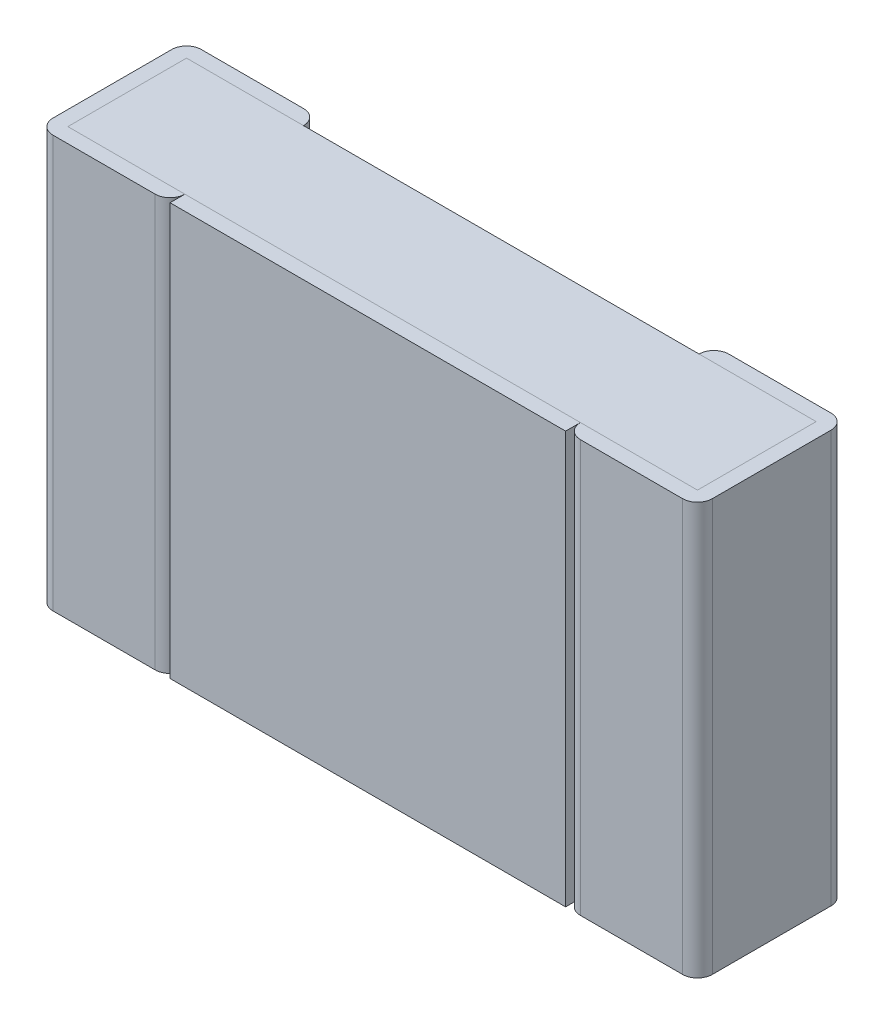
ISO-10303-21;
HEADER;
FILE_DESCRIPTION(('STEP AP214'),'2;1');
FILE_NAME('part.step','',(''),(''),'','','');
FILE_SCHEMA(('AUTOMOTIVE_DESIGN { 1 0 10303 214 1 1 1 1 }'));
ENDSEC;
DATA;
#1=APPLICATION_CONTEXT('core data for automotive mechanical design processes');
#2=APPLICATION_PROTOCOL_DEFINITION('international standard','automotive_design',2000,#1);
#3=PRODUCT_CONTEXT('',#1,'mechanical');
#4=PRODUCT('Part','Part','',(#3));
#5=PRODUCT_RELATED_PRODUCT_CATEGORY('part','',(#4));
#6=PRODUCT_DEFINITION_FORMATION('','',#4);
#7=PRODUCT_DEFINITION_CONTEXT('part definition',#1,'design');
#8=PRODUCT_DEFINITION('design','',#6,#7);
#9=PRODUCT_DEFINITION_SHAPE('','',#8);
#10=(LENGTH_UNIT() NAMED_UNIT(*) SI_UNIT(.MILLI.,.METRE.));
#11=(NAMED_UNIT(*) PLANE_ANGLE_UNIT() SI_UNIT($,.RADIAN.));
#12=(NAMED_UNIT(*) SI_UNIT($,.STERADIAN.) SOLID_ANGLE_UNIT());
#13=UNCERTAINTY_MEASURE_WITH_UNIT(LENGTH_MEASURE(1.E-05),#10,'distance_accuracy_value','');
#14=(GEOMETRIC_REPRESENTATION_CONTEXT(3) GLOBAL_UNCERTAINTY_ASSIGNED_CONTEXT((#13)) GLOBAL_UNIT_ASSIGNED_CONTEXT((#10,
#11,#12)) REPRESENTATION_CONTEXT('',''));
#15=CARTESIAN_POINT('',(0.,0.,0.));
#16=DIRECTION('',(0.,0.,1.));
#17=DIRECTION('',(1.,0.,0.));
#18=AXIS2_PLACEMENT_3D('',#15,#16,#17);
#19=CARTESIAN_POINT('',(-0.6,-0.625,0.45));
#20=DIRECTION('',(0.,0.,1.));
#21=DIRECTION('',(1.,0.,0.));
#22=AXIS2_PLACEMENT_3D('',#19,#20,#21);
#23=PLANE('',#22);
#24=DIRECTION('',(0.,1.,0.));
#25=VECTOR('',#24,1.);
#26=CARTESIAN_POINT('',(-0.6,-0.625,0.45));
#27=LINE('',#26,#25);
#28=CARTESIAN_POINT('',(-0.6,-0.625,0.45));
#29=VERTEX_POINT('',#28);
#30=CARTESIAN_POINT('',(-0.6,0.625,0.45));
#31=VERTEX_POINT('',#30);
#32=EDGE_CURVE('E276',#29,#31,#27,.T.);
#33=ORIENTED_EDGE('',*,*,#32,.F.);
#34=DIRECTION('',(1.,0.,0.));
#35=VECTOR('',#34,1.);
#36=CARTESIAN_POINT('',(-0.6,-0.625,0.45));
#37=LINE('',#36,#35);
#38=CARTESIAN_POINT('',(0.6,-0.625,0.45));
#39=VERTEX_POINT('',#38);
#40=EDGE_CURVE('E19',#29,#39,#37,.T.);
#41=ORIENTED_EDGE('',*,*,#40,.T.);
#42=DIRECTION('',(0.,1.,0.));
#43=VECTOR('',#42,1.);
#44=CARTESIAN_POINT('',(0.6,-0.625,0.45));
#45=LINE('',#44,#43);
#46=CARTESIAN_POINT('',(0.6,0.625,0.45));
#47=VERTEX_POINT('',#46);
#48=EDGE_CURVE('E10',#39,#47,#45,.T.);
#49=ORIENTED_EDGE('',*,*,#48,.T.);
#50=DIRECTION('',(1.,0.,0.));
#51=VECTOR('',#50,1.);
#52=CARTESIAN_POINT('',(-0.6,0.625,0.45));
#53=LINE('',#52,#51);
#54=EDGE_CURVE('E304',#31,#47,#53,.T.);
#55=ORIENTED_EDGE('',*,*,#54,.F.);
#56=EDGE_LOOP('',(#33,#41,#49,#55));
#57=FACE_BOUND('',#56,.T.);
#58=ADVANCED_FACE('F15',(#57),#23,.T.);
#59=CARTESIAN_POINT('',(0.6,-0.625,0.405));
#60=DIRECTION('',(1.,0.,0.));
#61=DIRECTION('',(0.,1.,0.));
#62=AXIS2_PLACEMENT_3D('',#59,#60,#61);
#63=PLANE('',#62);
#64=DIRECTION('',(0.,0.,1.));
#65=VECTOR('',#64,1.);
#66=CARTESIAN_POINT('',(0.6,-0.625,0.405));
#67=LINE('',#66,#65);
#68=CARTESIAN_POINT('',(0.6,-0.625,0.405));
#69=VERTEX_POINT('',#68);
#70=EDGE_CURVE('E215',#69,#39,#67,.T.);
#71=ORIENTED_EDGE('',*,*,#70,.F.);
#72=DIRECTION('',(0.,1.,0.));
#73=VECTOR('',#72,1.);
#74=CARTESIAN_POINT('',(0.6,-0.625,0.405));
#75=LINE('',#74,#73);
#76=CARTESIAN_POINT('',(0.6,0.625,0.405));
#77=VERTEX_POINT('',#76);
#78=EDGE_CURVE('E26',#69,#77,#75,.T.);
#79=ORIENTED_EDGE('',*,*,#78,.T.);
#80=DIRECTION('',(0.,0.,1.));
#81=VECTOR('',#80,1.);
#82=CARTESIAN_POINT('',(0.6,0.625,0.405));
#83=LINE('',#82,#81);
#84=EDGE_CURVE('E206',#77,#47,#83,.T.);
#85=ORIENTED_EDGE('',*,*,#84,.T.);
#86=ORIENTED_EDGE('',*,*,#48,.F.);
#87=EDGE_LOOP('',(#71,#79,#85,#86));
#88=FACE_BOUND('',#87,.T.);
#89=ADVANCED_FACE('F542',(#88),#63,.T.);
#90=CARTESIAN_POINT('',(0.645,-0.625,0.405));
#91=DIRECTION('',(0.,1.,0.));
#92=DIRECTION('',(-1.,0.,0.));
#93=AXIS2_PLACEMENT_3D('',#90,#91,#92);
#94=CYLINDRICAL_SURFACE('',#93,0.045);
#95=CARTESIAN_POINT('',(0.645,-0.625,0.405));
#96=DIRECTION('',(0.,1.,0.));
#97=DIRECTION('',(0.,0.,1.));
#98=AXIS2_PLACEMENT_3D('',#95,#96,#97);
#99=CIRCLE('',#98,0.045);
#100=CARTESIAN_POINT('',(0.645,-0.625,0.45));
#101=VERTEX_POINT('',#100);
#102=EDGE_CURVE('E224',#69,#101,#99,.T.);
#103=ORIENTED_EDGE('',*,*,#102,.T.);
#104=DIRECTION('',(0.,1.,0.));
#105=VECTOR('',#104,1.);
#106=CARTESIAN_POINT('',(0.645,-0.625,0.45));
#107=LINE('',#106,#105);
#108=CARTESIAN_POINT('',(0.645,0.625,0.45));
#109=VERTEX_POINT('',#108);
#110=EDGE_CURVE('E268',#101,#109,#107,.T.);
#111=ORIENTED_EDGE('',*,*,#110,.T.);
#112=CARTESIAN_POINT('',(0.645,0.625,0.405));
#113=DIRECTION('',(0.,1.,0.));
#114=DIRECTION('',(0.,0.,1.));
#115=AXIS2_PLACEMENT_3D('',#112,#113,#114);
#116=CIRCLE('',#115,0.045);
#117=EDGE_CURVE('E334',#77,#109,#116,.T.);
#118=ORIENTED_EDGE('',*,*,#117,.F.);
#119=ORIENTED_EDGE('',*,*,#78,.F.);
#120=EDGE_LOOP('',(#103,#111,#118,#119));
#121=FACE_BOUND('',#120,.T.);
#122=ADVANCED_FACE('F547',(#121),#94,.T.);
#123=CARTESIAN_POINT('',(0.6,-0.625,0.45));
#124=DIRECTION('',(0.,0.,1.));
#125=DIRECTION('',(1.,0.,0.));
#126=AXIS2_PLACEMENT_3D('',#123,#124,#125);
#127=PLANE('',#126);
#128=DIRECTION('',(1.,0.,0.));
#129=VECTOR('',#128,1.);
#130=CARTESIAN_POINT('',(0.6,0.625,0.45));
#131=LINE('',#130,#129);
#132=CARTESIAN_POINT('',(0.955,0.625,0.45));
#133=VERTEX_POINT('',#132);
#134=EDGE_CURVE('E325',#109,#133,#131,.T.);
#135=ORIENTED_EDGE('',*,*,#134,.F.);
#136=ORIENTED_EDGE('',*,*,#110,.F.);
#137=DIRECTION('',(1.,0.,0.));
#138=VECTOR('',#137,1.);
#139=CARTESIAN_POINT('',(0.6,-0.625,0.45));
#140=LINE('',#139,#138);
#141=CARTESIAN_POINT('',(0.955,-0.625,0.45));
#142=VERTEX_POINT('',#141);
#143=EDGE_CURVE('E231',#101,#142,#140,.T.);
#144=ORIENTED_EDGE('',*,*,#143,.T.);
#145=DIRECTION('',(0.,1.,0.));
#146=VECTOR('',#145,1.);
#147=CARTESIAN_POINT('',(0.955,-0.625,0.45));
#148=LINE('',#147,#146);
#149=EDGE_CURVE('E271',#142,#133,#148,.T.);
#150=ORIENTED_EDGE('',*,*,#149,.T.);
#151=EDGE_LOOP('',(#135,#136,#144,#150));
#152=FACE_BOUND('',#151,.T.);
#153=ADVANCED_FACE('F489',(#152),#127,.T.);
#154=CARTESIAN_POINT('',(0.955,-0.625,0.405));
#155=DIRECTION('',(0.,1.,0.));
#156=DIRECTION('',(1.,0.,0.));
#157=AXIS2_PLACEMENT_3D('',#154,#155,#156);
#158=CYLINDRICAL_SURFACE('',#157,0.045);
#159=DIRECTION('',(0.,1.,0.));
#160=VECTOR('',#159,1.);
#161=CARTESIAN_POINT('',(1.,-0.625,0.405));
#162=LINE('',#161,#160);
#163=CARTESIAN_POINT('',(1.,-0.625,0.405));
#164=VERTEX_POINT('',#163);
#165=CARTESIAN_POINT('',(1.,0.625,0.405));
#166=VERTEX_POINT('',#165);
#167=EDGE_CURVE('E328',#164,#166,#162,.T.);
#168=ORIENTED_EDGE('',*,*,#167,.T.);
#169=CARTESIAN_POINT('',(0.955,0.625,0.405));
#170=DIRECTION('',(0.,-1.,0.));
#171=DIRECTION('',(0.,0.,1.));
#172=AXIS2_PLACEMENT_3D('',#169,#170,#171);
#173=CIRCLE('',#172,0.045);
#174=EDGE_CURVE('E288',#166,#133,#173,.T.);
#175=ORIENTED_EDGE('',*,*,#174,.T.);
#176=ORIENTED_EDGE('',*,*,#149,.F.);
#177=CARTESIAN_POINT('',(0.955,-0.625,0.405));
#178=DIRECTION('',(0.,-1.,0.));
#179=DIRECTION('',(0.,0.,1.));
#180=AXIS2_PLACEMENT_3D('',#177,#178,#179);
#181=CIRCLE('',#180,0.045);
#182=EDGE_CURVE('E255',#164,#142,#181,.T.);
#183=ORIENTED_EDGE('',*,*,#182,.F.);
#184=EDGE_LOOP('',(#168,#175,#176,#183));
#185=FACE_BOUND('',#184,.T.);
#186=ADVANCED_FACE('F476',(#185),#158,.T.);
#187=CARTESIAN_POINT('',(1.,-0.625,0.));
#188=DIRECTION('',(1.,0.,0.));
#189=DIRECTION('',(0.,1.,0.));
#190=AXIS2_PLACEMENT_3D('',#187,#188,#189);
#191=PLANE('',#190);
#192=DIRECTION('',(0.,0.,1.));
#193=VECTOR('',#192,1.);
#194=CARTESIAN_POINT('',(1.,-0.625,0.));
#195=LINE('',#194,#193);
#196=CARTESIAN_POINT('',(1.,-0.625,0.045));
#197=VERTEX_POINT('',#196);
#198=EDGE_CURVE('E251',#197,#164,#195,.T.);
#199=ORIENTED_EDGE('',*,*,#198,.F.);
#200=DIRECTION('',(0.,1.,0.));
#201=VECTOR('',#200,1.);
#202=CARTESIAN_POINT('',(1.,-0.625,0.045));
#203=LINE('',#202,#201);
#204=CARTESIAN_POINT('',(1.,0.625,0.045));
#205=VERTEX_POINT('',#204);
#206=EDGE_CURVE('E363',#197,#205,#203,.T.);
#207=ORIENTED_EDGE('',*,*,#206,.T.);
#208=DIRECTION('',(0.,0.,1.));
#209=VECTOR('',#208,1.);
#210=CARTESIAN_POINT('',(1.,0.625,0.));
#211=LINE('',#210,#209);
#212=EDGE_CURVE('E283',#205,#166,#211,.T.);
#213=ORIENTED_EDGE('',*,*,#212,.T.);
#214=ORIENTED_EDGE('',*,*,#167,.F.);
#215=EDGE_LOOP('',(#199,#207,#213,#214));
#216=FACE_BOUND('',#215,.T.);
#217=ADVANCED_FACE('F481',(#216),#191,.T.);
#218=CARTESIAN_POINT('',(0.955,-0.625,0.045));
#219=DIRECTION('',(0.,1.,0.));
#220=DIRECTION('',(1.,0.,0.));
#221=AXIS2_PLACEMENT_3D('',#218,#219,#220);
#222=CYLINDRICAL_SURFACE('',#221,0.045);
#223=CARTESIAN_POINT('',(0.955,-0.625,0.045));
#224=DIRECTION('',(0.,1.,0.));
#225=DIRECTION('',(0.,0.,1.));
#226=AXIS2_PLACEMENT_3D('',#223,#224,#225);
#227=CIRCLE('',#226,0.045);
#228=CARTESIAN_POINT('',(0.955,-0.625,0.));
#229=VERTEX_POINT('',#228);
#230=EDGE_CURVE('E235',#197,#229,#227,.T.);
#231=ORIENTED_EDGE('',*,*,#230,.T.);
#232=DIRECTION('',(0.,1.,0.));
#233=VECTOR('',#232,1.);
#234=CARTESIAN_POINT('',(0.955,-0.625,0.));
#235=LINE('',#234,#233);
#236=CARTESIAN_POINT('',(0.955,0.625,0.));
#237=VERTEX_POINT('',#236);
#238=EDGE_CURVE('E205',#229,#237,#235,.T.);
#239=ORIENTED_EDGE('',*,*,#238,.T.);
#240=CARTESIAN_POINT('',(0.955,0.625,0.045));
#241=DIRECTION('',(0.,1.,0.));
#242=DIRECTION('',(0.,0.,1.));
#243=AXIS2_PLACEMENT_3D('',#240,#241,#242);
#244=CIRCLE('',#243,0.045);
#245=EDGE_CURVE('E287',#205,#237,#244,.T.);
#246=ORIENTED_EDGE('',*,*,#245,.F.);
#247=ORIENTED_EDGE('',*,*,#206,.F.);
#248=EDGE_LOOP('',(#231,#239,#246,#247));
#249=FACE_BOUND('',#248,.T.);
#250=ADVANCED_FACE('F496',(#249),#222,.T.);
#251=CARTESIAN_POINT('',(0.6,-0.625,0.));
#252=DIRECTION('',(0.,0.,1.));
#253=DIRECTION('',(1.,0.,0.));
#254=AXIS2_PLACEMENT_3D('',#251,#252,#253);
#255=PLANE('',#254);
#256=ORIENTED_EDGE('',*,*,#238,.F.);
#257=DIRECTION('',(1.,0.,0.));
#258=VECTOR('',#257,1.);
#259=CARTESIAN_POINT('',(0.6,-0.625,0.));
#260=LINE('',#259,#258);
#261=CARTESIAN_POINT('',(0.645,-0.625,0.));
#262=VERTEX_POINT('',#261);
#263=EDGE_CURVE('E209',#262,#229,#260,.T.);
#264=ORIENTED_EDGE('',*,*,#263,.F.);
#265=DIRECTION('',(0.,1.,0.));
#266=VECTOR('',#265,1.);
#267=CARTESIAN_POINT('',(0.645,-0.625,0.));
#268=LINE('',#267,#266);
#269=CARTESIAN_POINT('',(0.645,0.625,0.));
#270=VERTEX_POINT('',#269);
#271=EDGE_CURVE('E193',#262,#270,#268,.T.);
#272=ORIENTED_EDGE('',*,*,#271,.T.);
#273=DIRECTION('',(1.,0.,0.));
#274=VECTOR('',#273,1.);
#275=CARTESIAN_POINT('',(0.6,0.625,0.));
#276=LINE('',#275,#274);
#277=EDGE_CURVE('E333',#270,#237,#276,.T.);
#278=ORIENTED_EDGE('',*,*,#277,.T.);
#279=EDGE_LOOP('',(#256,#264,#272,#278));
#280=FACE_BOUND('',#279,.T.);
#281=ADVANCED_FACE('F210',(#280),#255,.F.);
#282=CARTESIAN_POINT('',(0.645,-0.625,0.045));
#283=DIRECTION('',(0.,1.,0.));
#284=DIRECTION('',(-1.,0.,0.));
#285=AXIS2_PLACEMENT_3D('',#282,#283,#284);
#286=CYLINDRICAL_SURFACE('',#285,0.045);
#287=DIRECTION('',(0.,1.,0.));
#288=VECTOR('',#287,1.);
#289=CARTESIAN_POINT('',(0.6,-0.625,0.045));
#290=LINE('',#289,#288);
#291=CARTESIAN_POINT('',(0.6,-0.625,0.045));
#292=VERTEX_POINT('',#291);
#293=CARTESIAN_POINT('',(0.6,0.625,0.045));
#294=VERTEX_POINT('',#293);
#295=EDGE_CURVE('E256',#292,#294,#290,.T.);
#296=ORIENTED_EDGE('',*,*,#295,.T.);
#297=CARTESIAN_POINT('',(0.645,0.625,0.045));
#298=DIRECTION('',(0.,-1.,0.));
#299=DIRECTION('',(0.,0.,1.));
#300=AXIS2_PLACEMENT_3D('',#297,#298,#299);
#301=CIRCLE('',#300,0.045);
#302=EDGE_CURVE('E200',#294,#270,#301,.T.);
#303=ORIENTED_EDGE('',*,*,#302,.T.);
#304=ORIENTED_EDGE('',*,*,#271,.F.);
#305=CARTESIAN_POINT('',(0.645,-0.625,0.045));
#306=DIRECTION('',(0.,-1.,0.));
#307=DIRECTION('',(0.,0.,1.));
#308=AXIS2_PLACEMENT_3D('',#305,#306,#307);
#309=CIRCLE('',#308,0.045);
#310=EDGE_CURVE('E198',#292,#262,#309,.T.);
#311=ORIENTED_EDGE('',*,*,#310,.F.);
#312=EDGE_LOOP('',(#296,#303,#304,#311));
#313=FACE_BOUND('',#312,.T.);
#314=ADVANCED_FACE('F196',(#313),#286,.T.);
#315=CARTESIAN_POINT('',(-0.6,0.625,0.405));
#316=DIRECTION('',(0.,1.,0.));
#317=DIRECTION('',(1.,0.,0.));
#318=AXIS2_PLACEMENT_3D('',#315,#316,#317);
#319=PLANE('',#318);
#320=DIRECTION('',(1.,0.,0.));
#321=VECTOR('',#320,1.);
#322=CARTESIAN_POINT('',(-0.6,0.625,0.405));
#323=LINE('',#322,#321);
#324=CARTESIAN_POINT('',(-0.6,0.625,0.405));
#325=VERTEX_POINT('',#324);
#326=EDGE_CURVE('E294',#325,#77,#323,.T.);
#327=ORIENTED_EDGE('',*,*,#326,.F.);
#328=DIRECTION('',(0.,0.,1.));
#329=VECTOR('',#328,1.);
#330=CARTESIAN_POINT('',(-0.6,0.625,0.405));
#331=LINE('',#330,#329);
#332=EDGE_CURVE('E329',#325,#31,#331,.T.);
#333=ORIENTED_EDGE('',*,*,#332,.T.);
#334=ORIENTED_EDGE('',*,*,#54,.T.);
#335=ORIENTED_EDGE('',*,*,#84,.F.);
#336=EDGE_LOOP('',(#327,#333,#334,#335));
#337=FACE_BOUND('',#336,.T.);
#338=ADVANCED_FACE('F454',(#337),#319,.T.);
#339=CARTESIAN_POINT('',(0.6,0.625,0.));
#340=DIRECTION('',(0.,1.,0.));
#341=DIRECTION('',(1.,0.,0.));
#342=AXIS2_PLACEMENT_3D('',#339,#340,#341);
#343=PLANE('',#342);
#344=ORIENTED_EDGE('',*,*,#277,.F.);
#345=ORIENTED_EDGE('',*,*,#302,.F.);
#346=DIRECTION('',(1.,0.,0.));
#347=VECTOR('',#346,1.);
#348=CARTESIAN_POINT('',(-0.955,0.625,0.045));
#349=LINE('',#348,#347);
#350=CARTESIAN_POINT('',(0.955,0.625,0.045));
#351=VERTEX_POINT('',#350);
#352=EDGE_CURVE('E376',#294,#351,#349,.T.);
#353=ORIENTED_EDGE('',*,*,#352,.T.);
#354=DIRECTION('',(0.,0.,1.));
#355=VECTOR('',#354,1.);
#356=CARTESIAN_POINT('',(0.955,0.625,0.045));
#357=LINE('',#356,#355);
#358=CARTESIAN_POINT('',(0.955,0.625,0.405));
#359=VERTEX_POINT('',#358);
#360=EDGE_CURVE('E293',#351,#359,#357,.T.);
#361=ORIENTED_EDGE('',*,*,#360,.T.);
#362=DIRECTION('',(1.,0.,0.));
#363=VECTOR('',#362,1.);
#364=CARTESIAN_POINT('',(-0.955,0.625,0.405));
#365=LINE('',#364,#363);
#366=EDGE_CURVE('E289',#77,#359,#365,.T.);
#367=ORIENTED_EDGE('',*,*,#366,.F.);
#368=ORIENTED_EDGE('',*,*,#117,.T.);
#369=ORIENTED_EDGE('',*,*,#134,.T.);
#370=ORIENTED_EDGE('',*,*,#174,.F.);
#371=ORIENTED_EDGE('',*,*,#212,.F.);
#372=ORIENTED_EDGE('',*,*,#245,.T.);
#373=EDGE_LOOP('',(#344,#345,#353,#361,#367,#368,#369,#370,#371,#372));
#374=FACE_BOUND('',#373,.T.);
#375=ADVANCED_FACE('F484',(#374),#343,.T.);
#376=CARTESIAN_POINT('',(-0.6,-0.625,0.405));
#377=DIRECTION('',(1.,0.,0.));
#378=DIRECTION('',(0.,1.,0.));
#379=AXIS2_PLACEMENT_3D('',#376,#377,#378);
#380=PLANE('',#379);
#381=ORIENTED_EDGE('',*,*,#32,.T.);
#382=ORIENTED_EDGE('',*,*,#332,.F.);
#383=DIRECTION('',(0.,1.,0.));
#384=VECTOR('',#383,1.);
#385=CARTESIAN_POINT('',(-0.6,-0.625,0.405));
#386=LINE('',#385,#384);
#387=CARTESIAN_POINT('',(-0.6,-0.625,0.405));
#388=VERTEX_POINT('',#387);
#389=EDGE_CURVE('E313',#388,#325,#386,.T.);
#390=ORIENTED_EDGE('',*,*,#389,.F.);
#391=DIRECTION('',(0.,0.,1.));
#392=VECTOR('',#391,1.);
#393=CARTESIAN_POINT('',(-0.6,-0.625,0.405));
#394=LINE('',#393,#392);
#395=EDGE_CURVE('E272',#388,#29,#394,.T.);
#396=ORIENTED_EDGE('',*,*,#395,.T.);
#397=EDGE_LOOP('',(#381,#382,#390,#396));
#398=FACE_BOUND('',#397,.T.);
#399=ADVANCED_FACE('F457',(#398),#380,.F.);
#400=CARTESIAN_POINT('',(-0.6,-0.625,0.405));
#401=DIRECTION('',(0.,1.,0.));
#402=DIRECTION('',(1.,0.,0.));
#403=AXIS2_PLACEMENT_3D('',#400,#401,#402);
#404=PLANE('',#403);
#405=ORIENTED_EDGE('',*,*,#70,.T.);
#406=ORIENTED_EDGE('',*,*,#40,.F.);
#407=ORIENTED_EDGE('',*,*,#395,.F.);
#408=DIRECTION('',(1.,0.,0.));
#409=VECTOR('',#408,1.);
#410=CARTESIAN_POINT('',(-0.6,-0.625,0.405));
#411=LINE('',#410,#409);
#412=EDGE_CURVE('E348',#388,#69,#411,.T.);
#413=ORIENTED_EDGE('',*,*,#412,.T.);
#414=EDGE_LOOP('',(#405,#406,#407,#413));
#415=FACE_BOUND('',#414,.T.);
#416=ADVANCED_FACE('F462',(#415),#404,.F.);
#417=CARTESIAN_POINT('',(0.6,-0.625,0.));
#418=DIRECTION('',(0.,1.,0.));
#419=DIRECTION('',(1.,0.,0.));
#420=AXIS2_PLACEMENT_3D('',#417,#418,#419);
#421=PLANE('',#420);
#422=ORIENTED_EDGE('',*,*,#230,.F.);
#423=ORIENTED_EDGE('',*,*,#198,.T.);
#424=ORIENTED_EDGE('',*,*,#182,.T.);
#425=ORIENTED_EDGE('',*,*,#143,.F.);
#426=ORIENTED_EDGE('',*,*,#102,.F.);
#427=DIRECTION('',(1.,0.,0.));
#428=VECTOR('',#427,1.);
#429=CARTESIAN_POINT('',(-0.955,-0.625,0.405));
#430=LINE('',#429,#428);
#431=CARTESIAN_POINT('',(0.955,-0.625,0.405));
#432=VERTEX_POINT('',#431);
#433=EDGE_CURVE('E351',#69,#432,#430,.T.);
#434=ORIENTED_EDGE('',*,*,#433,.T.);
#435=DIRECTION('',(0.,0.,1.));
#436=VECTOR('',#435,1.);
#437=CARTESIAN_POINT('',(0.955,-0.625,0.045));
#438=LINE('',#437,#436);
#439=CARTESIAN_POINT('',(0.955,-0.625,0.045));
#440=VERTEX_POINT('',#439);
#441=EDGE_CURVE('E367',#440,#432,#438,.T.);
#442=ORIENTED_EDGE('',*,*,#441,.F.);
#443=DIRECTION('',(1.,0.,0.));
#444=VECTOR('',#443,1.);
#445=CARTESIAN_POINT('',(-0.955,-0.625,0.045));
#446=LINE('',#445,#444);
#447=EDGE_CURVE('E221',#292,#440,#446,.T.);
#448=ORIENTED_EDGE('',*,*,#447,.F.);
#449=ORIENTED_EDGE('',*,*,#310,.T.);
#450=ORIENTED_EDGE('',*,*,#263,.T.);
#451=EDGE_LOOP('',(#422,#423,#424,#425,#426,#434,#442,#448,#449,#450));
#452=FACE_BOUND('',#451,.T.);
#453=ADVANCED_FACE('F218',(#452),#421,.F.);
#454=CARTESIAN_POINT('',(-0.955,-0.625,0.045));
#455=DIRECTION('',(0.,0.,1.));
#456=DIRECTION('',(1.,0.,0.));
#457=AXIS2_PLACEMENT_3D('',#454,#455,#456);
#458=PLANE('',#457);
#459=DIRECTION('',(1.,0.,0.));
#460=VECTOR('',#459,1.);
#461=CARTESIAN_POINT('',(-0.955,0.625,0.045));
#462=LINE('',#461,#460);
#463=CARTESIAN_POINT('',(-0.6,0.625,0.045));
#464=VERTEX_POINT('',#463);
#465=EDGE_CURVE('E259',#464,#294,#462,.T.);
#466=ORIENTED_EDGE('',*,*,#465,.T.);
#467=ORIENTED_EDGE('',*,*,#295,.F.);
#468=DIRECTION('',(1.,0.,0.));
#469=VECTOR('',#468,1.);
#470=CARTESIAN_POINT('',(-0.955,-0.625,0.045));
#471=LINE('',#470,#469);
#472=CARTESIAN_POINT('',(-0.6,-0.625,0.045));
#473=VERTEX_POINT('',#472);
#474=EDGE_CURVE('E410',#473,#292,#471,.T.);
#475=ORIENTED_EDGE('',*,*,#474,.F.);
#476=DIRECTION('',(0.,1.,0.));
#477=VECTOR('',#476,1.);
#478=CARTESIAN_POINT('',(-0.6,-0.625,0.045));
#479=LINE('',#478,#477);
#480=EDGE_CURVE('E383',#473,#464,#479,.T.);
#481=ORIENTED_EDGE('',*,*,#480,.T.);
#482=EDGE_LOOP('',(#466,#467,#475,#481));
#483=FACE_BOUND('',#482,.T.);
#484=ADVANCED_FACE('F523',(#483),#458,.F.);
#485=CARTESIAN_POINT('',(-0.955,0.625,0.045));
#486=DIRECTION('',(0.,1.,0.));
#487=DIRECTION('',(1.,0.,0.));
#488=AXIS2_PLACEMENT_3D('',#485,#486,#487);
#489=PLANE('',#488);
#490=DIRECTION('',(1.,0.,0.));
#491=VECTOR('',#490,1.);
#492=CARTESIAN_POINT('',(-0.955,0.625,0.045));
#493=LINE('',#492,#491);
#494=CARTESIAN_POINT('',(-0.955,0.625,0.045));
#495=VERTEX_POINT('',#494);
#496=EDGE_CURVE('E245',#495,#464,#493,.T.);
#497=ORIENTED_EDGE('',*,*,#496,.F.);
#498=DIRECTION('',(0.,0.,1.));
#499=VECTOR('',#498,1.);
#500=CARTESIAN_POINT('',(-0.955,0.625,0.045));
#501=LINE('',#500,#499);
#502=CARTESIAN_POINT('',(-0.955,0.625,0.405));
#503=VERTEX_POINT('',#502);
#504=EDGE_CURVE('E242',#495,#503,#501,.T.);
#505=ORIENTED_EDGE('',*,*,#504,.T.);
#506=DIRECTION('',(1.,0.,0.));
#507=VECTOR('',#506,1.);
#508=CARTESIAN_POINT('',(-0.955,0.625,0.405));
#509=LINE('',#508,#507);
#510=EDGE_CURVE('E246',#503,#325,#509,.T.);
#511=ORIENTED_EDGE('',*,*,#510,.T.);
#512=ORIENTED_EDGE('',*,*,#326,.T.);
#513=ORIENTED_EDGE('',*,*,#366,.T.);
#514=ORIENTED_EDGE('',*,*,#360,.F.);
#515=ORIENTED_EDGE('',*,*,#352,.F.);
#516=ORIENTED_EDGE('',*,*,#465,.F.);
#517=EDGE_LOOP('',(#497,#505,#511,#512,#513,#514,#515,#516));
#518=FACE_BOUND('',#517,.T.);
#519=ADVANCED_FACE('F529',(#518),#489,.T.);
#520=CARTESIAN_POINT('',(-1.,-0.625,0.45));
#521=DIRECTION('',(0.,0.,1.));
#522=DIRECTION('',(1.,0.,0.));
#523=AXIS2_PLACEMENT_3D('',#520,#521,#522);
#524=PLANE('',#523);
#525=DIRECTION('',(1.,0.,0.));
#526=VECTOR('',#525,1.);
#527=CARTESIAN_POINT('',(-1.,0.625,0.45));
#528=LINE('',#527,#526);
#529=CARTESIAN_POINT('',(-0.955,0.625,0.45));
#530=VERTEX_POINT('',#529);
#531=CARTESIAN_POINT('',(-0.645,0.625,0.45));
#532=VERTEX_POINT('',#531);
#533=EDGE_CURVE('E267',#530,#532,#528,.T.);
#534=ORIENTED_EDGE('',*,*,#533,.F.);
#535=DIRECTION('',(0.,1.,0.));
#536=VECTOR('',#535,1.);
#537=CARTESIAN_POINT('',(-0.955,-0.625,0.45));
#538=LINE('',#537,#536);
#539=CARTESIAN_POINT('',(-0.955,-0.625,0.45));
#540=VERTEX_POINT('',#539);
#541=EDGE_CURVE('E277',#540,#530,#538,.T.);
#542=ORIENTED_EDGE('',*,*,#541,.F.);
#543=DIRECTION('',(1.,0.,0.));
#544=VECTOR('',#543,1.);
#545=CARTESIAN_POINT('',(-1.,-0.625,0.45));
#546=LINE('',#545,#544);
#547=CARTESIAN_POINT('',(-0.645,-0.625,0.45));
#548=VERTEX_POINT('',#547);
#549=EDGE_CURVE('E300',#540,#548,#546,.T.);
#550=ORIENTED_EDGE('',*,*,#549,.T.);
#551=DIRECTION('',(0.,1.,0.));
#552=VECTOR('',#551,1.);
#553=CARTESIAN_POINT('',(-0.645,-0.625,0.45));
#554=LINE('',#553,#552);
#555=EDGE_CURVE('E309',#548,#532,#554,.T.);
#556=ORIENTED_EDGE('',*,*,#555,.T.);
#557=EDGE_LOOP('',(#534,#542,#550,#556));
#558=FACE_BOUND('',#557,.T.);
#559=ADVANCED_FACE('F433',(#558),#524,.T.);
#560=CARTESIAN_POINT('',(-0.645,-0.625,0.405));
#561=DIRECTION('',(0.,1.,0.));
#562=DIRECTION('',(1.,0.,0.));
#563=AXIS2_PLACEMENT_3D('',#560,#561,#562);
#564=CYLINDRICAL_SURFACE('',#563,0.045);
#565=ORIENTED_EDGE('',*,*,#389,.T.);
#566=CARTESIAN_POINT('',(-0.645,0.625,0.405));
#567=DIRECTION('',(0.,-1.,0.));
#568=DIRECTION('',(0.,0.,1.));
#569=AXIS2_PLACEMENT_3D('',#566,#567,#568);
#570=CIRCLE('',#569,0.045);
#571=EDGE_CURVE('E263',#325,#532,#570,.T.);
#572=ORIENTED_EDGE('',*,*,#571,.T.);
#573=ORIENTED_EDGE('',*,*,#555,.F.);
#574=CARTESIAN_POINT('',(-0.645,-0.625,0.405));
#575=DIRECTION('',(0.,-1.,0.));
#576=DIRECTION('',(0.,0.,1.));
#577=AXIS2_PLACEMENT_3D('',#574,#575,#576);
#578=CIRCLE('',#577,0.045);
#579=EDGE_CURVE('E402',#388,#548,#578,.T.);
#580=ORIENTED_EDGE('',*,*,#579,.F.);
#581=EDGE_LOOP('',(#565,#572,#573,#580));
#582=FACE_BOUND('',#581,.T.);
#583=ADVANCED_FACE('F537',(#582),#564,.T.);
#584=CARTESIAN_POINT('',(-0.955,-0.625,0.045));
#585=DIRECTION('',(0.,1.,0.));
#586=DIRECTION('',(1.,0.,0.));
#587=AXIS2_PLACEMENT_3D('',#584,#585,#586);
#588=PLANE('',#587);
#589=ORIENTED_EDGE('',*,*,#474,.T.);
#590=ORIENTED_EDGE('',*,*,#447,.T.);
#591=ORIENTED_EDGE('',*,*,#441,.T.);
#592=ORIENTED_EDGE('',*,*,#433,.F.);
#593=ORIENTED_EDGE('',*,*,#412,.F.);
#594=DIRECTION('',(1.,0.,0.));
#595=VECTOR('',#594,1.);
#596=CARTESIAN_POINT('',(-0.955,-0.625,0.405));
#597=LINE('',#596,#595);
#598=CARTESIAN_POINT('',(-0.955,-0.625,0.405));
#599=VERTEX_POINT('',#598);
#600=EDGE_CURVE('E406',#599,#388,#597,.T.);
#601=ORIENTED_EDGE('',*,*,#600,.F.);
#602=DIRECTION('',(0.,0.,1.));
#603=VECTOR('',#602,1.);
#604=CARTESIAN_POINT('',(-0.955,-0.625,0.045));
#605=LINE('',#604,#603);
#606=CARTESIAN_POINT('',(-0.955,-0.625,0.045));
#607=VERTEX_POINT('',#606);
#608=EDGE_CURVE('E341',#607,#599,#605,.T.);
#609=ORIENTED_EDGE('',*,*,#608,.F.);
#610=DIRECTION('',(1.,0.,0.));
#611=VECTOR('',#610,1.);
#612=CARTESIAN_POINT('',(-0.955,-0.625,0.045));
#613=LINE('',#612,#611);
#614=EDGE_CURVE('E250',#607,#473,#613,.T.);
#615=ORIENTED_EDGE('',*,*,#614,.T.);
#616=EDGE_LOOP('',(#589,#590,#591,#592,#593,#601,#609,#615));
#617=FACE_BOUND('',#616,.T.);
#618=ADVANCED_FACE('F567',(#617),#588,.F.);
#619=CARTESIAN_POINT('',(-0.645,-0.625,0.045));
#620=DIRECTION('',(0.,1.,0.));
#621=DIRECTION('',(1.,0.,0.));
#622=AXIS2_PLACEMENT_3D('',#619,#620,#621);
#623=CYLINDRICAL_SURFACE('',#622,0.045);
#624=CARTESIAN_POINT('',(-0.645,-0.625,0.045));
#625=DIRECTION('',(0.,1.,0.));
#626=DIRECTION('',(0.,0.,1.));
#627=AXIS2_PLACEMENT_3D('',#624,#625,#626);
#628=CIRCLE('',#627,0.045);
#629=CARTESIAN_POINT('',(-0.645,-0.625,0.));
#630=VERTEX_POINT('',#629);
#631=EDGE_CURVE('E240',#473,#630,#628,.T.);
#632=ORIENTED_EDGE('',*,*,#631,.T.);
#633=DIRECTION('',(0.,1.,0.));
#634=VECTOR('',#633,1.);
#635=CARTESIAN_POINT('',(-0.645,-0.625,0.));
#636=LINE('',#635,#634);
#637=CARTESIAN_POINT('',(-0.645,0.625,0.));
#638=VERTEX_POINT('',#637);
#639=EDGE_CURVE('E380',#630,#638,#636,.T.);
#640=ORIENTED_EDGE('',*,*,#639,.T.);
#641=CARTESIAN_POINT('',(-0.645,0.625,0.045));
#642=DIRECTION('',(0.,1.,0.));
#643=DIRECTION('',(0.,0.,1.));
#644=AXIS2_PLACEMENT_3D('',#641,#642,#643);
#645=CIRCLE('',#644,0.045);
#646=EDGE_CURVE('E384',#464,#638,#645,.T.);
#647=ORIENTED_EDGE('',*,*,#646,.F.);
#648=ORIENTED_EDGE('',*,*,#480,.F.);
#649=EDGE_LOOP('',(#632,#640,#647,#648));
#650=FACE_BOUND('',#649,.T.);
#651=ADVANCED_FACE('F526',(#650),#623,.T.);
#652=CARTESIAN_POINT('',(-1.,-0.625,0.));
#653=DIRECTION('',(0.,0.,1.));
#654=DIRECTION('',(1.,0.,0.));
#655=AXIS2_PLACEMENT_3D('',#652,#653,#654);
#656=PLANE('',#655);
#657=ORIENTED_EDGE('',*,*,#639,.F.);
#658=DIRECTION('',(1.,0.,0.));
#659=VECTOR('',#658,1.);
#660=CARTESIAN_POINT('',(-1.,-0.625,0.));
#661=LINE('',#660,#659);
#662=CARTESIAN_POINT('',(-0.955,-0.625,0.));
#663=VERTEX_POINT('',#662);
#664=EDGE_CURVE('E314',#663,#630,#661,.T.);
#665=ORIENTED_EDGE('',*,*,#664,.F.);
#666=DIRECTION('',(0.,1.,0.));
#667=VECTOR('',#666,1.);
#668=CARTESIAN_POINT('',(-0.955,-0.625,0.));
#669=LINE('',#668,#667);
#670=CARTESIAN_POINT('',(-0.955,0.625,0.));
#671=VERTEX_POINT('',#670);
#672=EDGE_CURVE('E282',#663,#671,#669,.T.);
#673=ORIENTED_EDGE('',*,*,#672,.T.);
#674=DIRECTION('',(1.,0.,0.));
#675=VECTOR('',#674,1.);
#676=CARTESIAN_POINT('',(-1.,0.625,0.));
#677=LINE('',#676,#675);
#678=EDGE_CURVE('E321',#671,#638,#677,.T.);
#679=ORIENTED_EDGE('',*,*,#678,.T.);
#680=EDGE_LOOP('',(#657,#665,#673,#679));
#681=FACE_BOUND('',#680,.T.);
#682=ADVANCED_FACE('F564',(#681),#656,.F.);
#683=CARTESIAN_POINT('',(-1.,0.625,0.));
#684=DIRECTION('',(0.,1.,0.));
#685=DIRECTION('',(1.,0.,0.));
#686=AXIS2_PLACEMENT_3D('',#683,#684,#685);
#687=PLANE('',#686);
#688=ORIENTED_EDGE('',*,*,#678,.F.);
#689=CARTESIAN_POINT('',(-0.955,0.625,0.045));
#690=DIRECTION('',(0.,-1.,0.));
#691=DIRECTION('',(0.,0.,1.));
#692=AXIS2_PLACEMENT_3D('',#689,#690,#691);
#693=CIRCLE('',#692,0.045);
#694=CARTESIAN_POINT('',(-1.,0.625,0.045));
#695=VERTEX_POINT('',#694);
#696=EDGE_CURVE('E308',#695,#671,#693,.T.);
#697=ORIENTED_EDGE('',*,*,#696,.F.);
#698=DIRECTION('',(0.,0.,1.));
#699=VECTOR('',#698,1.);
#700=CARTESIAN_POINT('',(-1.,0.625,0.));
#701=LINE('',#700,#699);
#702=CARTESIAN_POINT('',(-1.,0.625,0.405));
#703=VERTEX_POINT('',#702);
#704=EDGE_CURVE('E356',#695,#703,#701,.T.);
#705=ORIENTED_EDGE('',*,*,#704,.T.);
#706=CARTESIAN_POINT('',(-0.955,0.625,0.405));
#707=DIRECTION('',(0.,1.,0.));
#708=DIRECTION('',(0.,0.,1.));
#709=AXIS2_PLACEMENT_3D('',#706,#707,#708);
#710=CIRCLE('',#709,0.045);
#711=EDGE_CURVE('E281',#703,#530,#710,.T.);
#712=ORIENTED_EDGE('',*,*,#711,.T.);
#713=ORIENTED_EDGE('',*,*,#533,.T.);
#714=ORIENTED_EDGE('',*,*,#571,.F.);
#715=ORIENTED_EDGE('',*,*,#510,.F.);
#716=ORIENTED_EDGE('',*,*,#504,.F.);
#717=ORIENTED_EDGE('',*,*,#496,.T.);
#718=ORIENTED_EDGE('',*,*,#646,.T.);
#719=EDGE_LOOP('',(#688,#697,#705,#712,#713,#714,#715,#716,#717,#718));
#720=FACE_BOUND('',#719,.T.);
#721=ADVANCED_FACE('F430',(#720),#687,.T.);
#722=CARTESIAN_POINT('',(-0.955,-0.625,0.405));
#723=DIRECTION('',(0.,1.,0.));
#724=DIRECTION('',(-1.,0.,0.));
#725=AXIS2_PLACEMENT_3D('',#722,#723,#724);
#726=CYLINDRICAL_SURFACE('',#725,0.045);
#727=CARTESIAN_POINT('',(-0.955,-0.625,0.405));
#728=DIRECTION('',(0.,1.,0.));
#729=DIRECTION('',(0.,0.,1.));
#730=AXIS2_PLACEMENT_3D('',#727,#728,#729);
#731=CIRCLE('',#730,0.045);
#732=CARTESIAN_POINT('',(-1.,-0.625,0.405));
#733=VERTEX_POINT('',#732);
#734=EDGE_CURVE('E295',#733,#540,#731,.T.);
#735=ORIENTED_EDGE('',*,*,#734,.T.);
#736=ORIENTED_EDGE('',*,*,#541,.T.);
#737=ORIENTED_EDGE('',*,*,#711,.F.);
#738=DIRECTION('',(0.,1.,0.));
#739=VECTOR('',#738,1.);
#740=CARTESIAN_POINT('',(-1.,-0.625,0.405));
#741=LINE('',#740,#739);
#742=EDGE_CURVE('E373',#733,#703,#741,.T.);
#743=ORIENTED_EDGE('',*,*,#742,.F.);
#744=EDGE_LOOP('',(#735,#736,#737,#743));
#745=FACE_BOUND('',#744,.T.);
#746=ADVANCED_FACE('F553',(#745),#726,.T.);
#747=CARTESIAN_POINT('',(-0.955,-0.625,0.045));
#748=DIRECTION('',(0.,1.,0.));
#749=DIRECTION('',(-1.,0.,0.));
#750=AXIS2_PLACEMENT_3D('',#747,#748,#749);
#751=CYLINDRICAL_SURFACE('',#750,0.045);
#752=DIRECTION('',(0.,1.,0.));
#753=VECTOR('',#752,1.);
#754=CARTESIAN_POINT('',(-1.,-0.625,0.045));
#755=LINE('',#754,#753);
#756=CARTESIAN_POINT('',(-1.,-0.625,0.045));
#757=VERTEX_POINT('',#756);
#758=EDGE_CURVE('E241',#757,#695,#755,.T.);
#759=ORIENTED_EDGE('',*,*,#758,.T.);
#760=ORIENTED_EDGE('',*,*,#696,.T.);
#761=ORIENTED_EDGE('',*,*,#672,.F.);
#762=CARTESIAN_POINT('',(-0.955,-0.625,0.045));
#763=DIRECTION('',(0.,-1.,0.));
#764=DIRECTION('',(0.,0.,1.));
#765=AXIS2_PLACEMENT_3D('',#762,#763,#764);
#766=CIRCLE('',#765,0.045);
#767=EDGE_CURVE('E299',#757,#663,#766,.T.);
#768=ORIENTED_EDGE('',*,*,#767,.F.);
#769=EDGE_LOOP('',(#759,#760,#761,#768));
#770=FACE_BOUND('',#769,.T.);
#771=ADVANCED_FACE('F555',(#770),#751,.T.);
#772=CARTESIAN_POINT('',(-1.,-0.625,0.));
#773=DIRECTION('',(0.,1.,0.));
#774=DIRECTION('',(1.,0.,0.));
#775=AXIS2_PLACEMENT_3D('',#772,#773,#774);
#776=PLANE('',#775);
#777=ORIENTED_EDGE('',*,*,#631,.F.);
#778=ORIENTED_EDGE('',*,*,#614,.F.);
#779=ORIENTED_EDGE('',*,*,#608,.T.);
#780=ORIENTED_EDGE('',*,*,#600,.T.);
#781=ORIENTED_EDGE('',*,*,#579,.T.);
#782=ORIENTED_EDGE('',*,*,#549,.F.);
#783=ORIENTED_EDGE('',*,*,#734,.F.);
#784=DIRECTION('',(0.,0.,1.));
#785=VECTOR('',#784,1.);
#786=CARTESIAN_POINT('',(-1.,-0.625,0.));
#787=LINE('',#786,#785);
#788=EDGE_CURVE('E237',#757,#733,#787,.T.);
#789=ORIENTED_EDGE('',*,*,#788,.F.);
#790=ORIENTED_EDGE('',*,*,#767,.T.);
#791=ORIENTED_EDGE('',*,*,#664,.T.);
#792=EDGE_LOOP('',(#777,#778,#779,#780,#781,#782,#783,#789,#790,#791));
#793=FACE_BOUND('',#792,.T.);
#794=ADVANCED_FACE('F17',(#793),#776,.F.);
#795=CARTESIAN_POINT('',(-1.,-0.625,0.));
#796=DIRECTION('',(1.,0.,0.));
#797=DIRECTION('',(0.,1.,0.));
#798=AXIS2_PLACEMENT_3D('',#795,#796,#797);
#799=PLANE('',#798);
#800=ORIENTED_EDGE('',*,*,#742,.T.);
#801=ORIENTED_EDGE('',*,*,#704,.F.);
#802=ORIENTED_EDGE('',*,*,#758,.F.);
#803=ORIENTED_EDGE('',*,*,#788,.T.);
#804=EDGE_LOOP('',(#800,#801,#802,#803));
#805=FACE_BOUND('',#804,.T.);
#806=ADVANCED_FACE('F568',(#805),#799,.F.);
#807=CLOSED_SHELL('',(#58,#89,#122,#153,#186,#217,#250,#281,#314,#338,#375,#399,#416,#453,#484,
#519,#559,#583,#618,#651,#682,#721,#746,#771,#794,#806));
#808=MANIFOLD_SOLID_BREP('B1',#807);
#809=ADVANCED_BREP_SHAPE_REPRESENTATION('',(#18,#808),#14);
#810=SHAPE_DEFINITION_REPRESENTATION(#9,#809);
ENDSEC;
END-ISO-10303-21;
